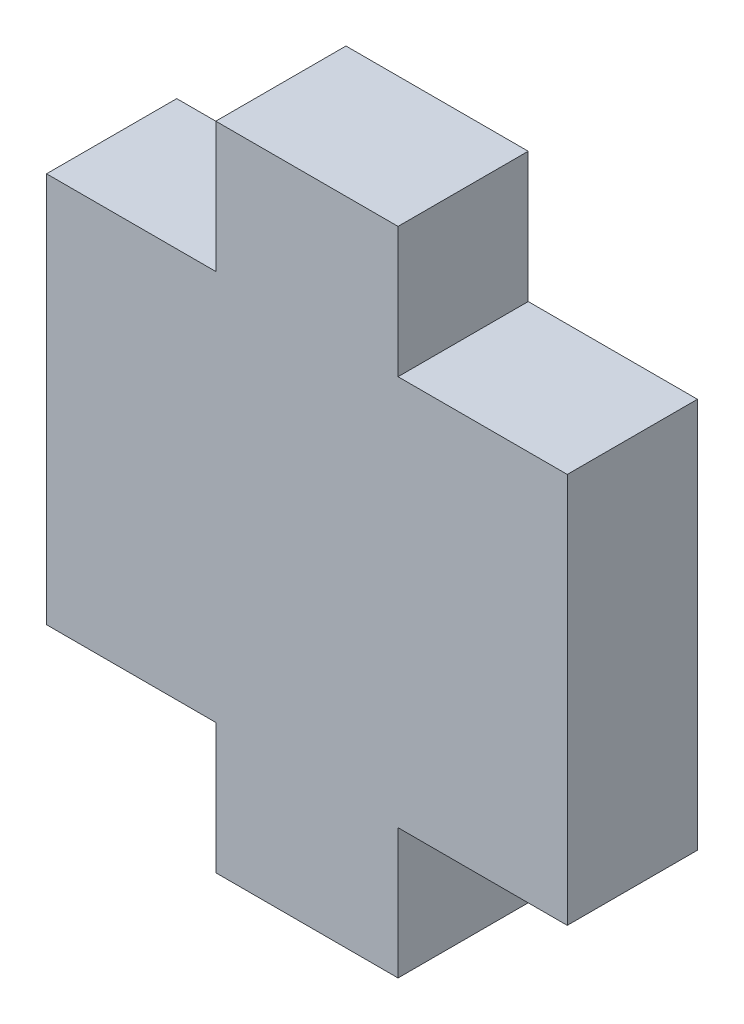
ISO-10303-21;
HEADER;
FILE_DESCRIPTION(('STEP AP214'),'2;1');
FILE_NAME('part.step','',(''),(''),'','','');
FILE_SCHEMA(('AUTOMOTIVE_DESIGN { 1 0 10303 214 1 1 1 1 }'));
ENDSEC;
DATA;
#1=APPLICATION_CONTEXT('core data for automotive mechanical design processes');
#2=APPLICATION_PROTOCOL_DEFINITION('international standard','automotive_design',2000,#1);
#3=PRODUCT_CONTEXT('',#1,'mechanical');
#4=PRODUCT('Part','Part','',(#3));
#5=PRODUCT_RELATED_PRODUCT_CATEGORY('part','',(#4));
#6=PRODUCT_DEFINITION_FORMATION('','',#4);
#7=PRODUCT_DEFINITION_CONTEXT('part definition',#1,'design');
#8=PRODUCT_DEFINITION('design','',#6,#7);
#9=PRODUCT_DEFINITION_SHAPE('','',#8);
#10=(LENGTH_UNIT() NAMED_UNIT(*) SI_UNIT(.MILLI.,.METRE.));
#11=(NAMED_UNIT(*) PLANE_ANGLE_UNIT() SI_UNIT($,.RADIAN.));
#12=(NAMED_UNIT(*) SI_UNIT($,.STERADIAN.) SOLID_ANGLE_UNIT());
#13=UNCERTAINTY_MEASURE_WITH_UNIT(LENGTH_MEASURE(1.E-05),#10,'distance_accuracy_value','');
#14=(GEOMETRIC_REPRESENTATION_CONTEXT(3) GLOBAL_UNCERTAINTY_ASSIGNED_CONTEXT((#13)) GLOBAL_UNIT_ASSIGNED_CONTEXT((#10,
#11,#12)) REPRESENTATION_CONTEXT('',''));
#15=CARTESIAN_POINT('',(0.,0.,0.));
#16=DIRECTION('',(0.,0.,1.));
#17=DIRECTION('',(1.,0.,0.));
#18=AXIS2_PLACEMENT_3D('',#15,#16,#17);
#19=CARTESIAN_POINT('',(-3.5,-7.5,5.));
#20=DIRECTION('',(0.,1.,0.));
#21=DIRECTION('',(-1.,0.,0.));
#22=AXIS2_PLACEMENT_3D('',#19,#20,#21);
#23=PLANE('',#22);
#24=DIRECTION('',(1.,0.,0.));
#25=VECTOR('',#24,1.);
#26=CARTESIAN_POINT('',(-3.5,-7.5,0.));
#27=LINE('',#26,#25);
#28=CARTESIAN_POINT('',(-10.,-7.5,0.));
#29=VERTEX_POINT('',#28);
#30=CARTESIAN_POINT('',(-3.5,-7.5,0.));
#31=VERTEX_POINT('',#30);
#32=EDGE_CURVE('E161',#29,#31,#27,.T.);
#33=ORIENTED_EDGE('',*,*,#32,.T.);
#34=DIRECTION('',(0.,0.,-1.));
#35=VECTOR('',#34,1.);
#36=CARTESIAN_POINT('',(-3.5,-7.5,5.));
#37=LINE('',#36,#35);
#38=CARTESIAN_POINT('',(-3.5,-7.5,5.));
#39=VERTEX_POINT('',#38);
#40=EDGE_CURVE('E11',#39,#31,#37,.T.);
#41=ORIENTED_EDGE('',*,*,#40,.F.);
#42=DIRECTION('',(1.,0.,0.));
#43=VECTOR('',#42,1.);
#44=CARTESIAN_POINT('',(-3.5,-7.5,5.));
#45=LINE('',#44,#43);
#46=CARTESIAN_POINT('',(-10.,-7.5,5.));
#47=VERTEX_POINT('',#46);
#48=EDGE_CURVE('E183',#47,#39,#45,.T.);
#49=ORIENTED_EDGE('',*,*,#48,.F.);
#50=DIRECTION('',(0.,0.,-1.));
#51=VECTOR('',#50,1.);
#52=CARTESIAN_POINT('',(-10.,-7.5,5.));
#53=LINE('',#52,#51);
#54=EDGE_CURVE('E157',#47,#29,#53,.T.);
#55=ORIENTED_EDGE('',*,*,#54,.T.);
#56=EDGE_LOOP('',(#33,#41,#49,#55));
#57=FACE_BOUND('',#56,.T.);
#58=ADVANCED_FACE('F41',(#57),#23,.F.);
#59=CARTESIAN_POINT('',(-3.5,-12.5,5.));
#60=DIRECTION('',(1.,0.,0.));
#61=DIRECTION('',(0.,0.,-1.));
#62=AXIS2_PLACEMENT_3D('',#59,#60,#61);
#63=PLANE('',#62);
#64=DIRECTION('',(0.,-1.,0.));
#65=VECTOR('',#64,1.);
#66=CARTESIAN_POINT('',(-3.5,-12.5,0.));
#67=LINE('',#66,#65);
#68=CARTESIAN_POINT('',(-3.5,-12.5,0.));
#69=VERTEX_POINT('',#68);
#70=EDGE_CURVE('E164',#31,#69,#67,.T.);
#71=ORIENTED_EDGE('',*,*,#70,.T.);
#72=DIRECTION('',(0.,0.,-1.));
#73=VECTOR('',#72,1.);
#74=CARTESIAN_POINT('',(-3.5,-12.5,5.));
#75=LINE('',#74,#73);
#76=CARTESIAN_POINT('',(-3.5,-12.5,5.));
#77=VERTEX_POINT('',#76);
#78=EDGE_CURVE('E49',#77,#69,#75,.T.);
#79=ORIENTED_EDGE('',*,*,#78,.F.);
#80=DIRECTION('',(0.,-1.,0.));
#81=VECTOR('',#80,1.);
#82=CARTESIAN_POINT('',(-3.5,-12.5,5.));
#83=LINE('',#82,#81);
#84=EDGE_CURVE('E112',#39,#77,#83,.T.);
#85=ORIENTED_EDGE('',*,*,#84,.F.);
#86=ORIENTED_EDGE('',*,*,#40,.T.);
#87=EDGE_LOOP('',(#71,#79,#85,#86));
#88=FACE_BOUND('',#87,.T.);
#89=ADVANCED_FACE('F261',(#88),#63,.F.);
#90=CARTESIAN_POINT('',(3.5,-12.5,5.));
#91=DIRECTION('',(0.,1.,0.));
#92=DIRECTION('',(0.,0.,1.));
#93=AXIS2_PLACEMENT_3D('',#90,#91,#92);
#94=PLANE('',#93);
#95=DIRECTION('',(1.,0.,0.));
#96=VECTOR('',#95,1.);
#97=CARTESIAN_POINT('',(3.5,-12.5,0.));
#98=LINE('',#97,#96);
#99=CARTESIAN_POINT('',(3.5,-12.5,0.));
#100=VERTEX_POINT('',#99);
#101=EDGE_CURVE('E166',#69,#100,#98,.T.);
#102=ORIENTED_EDGE('',*,*,#101,.T.);
#103=DIRECTION('',(0.,0.,-1.));
#104=VECTOR('',#103,1.);
#105=CARTESIAN_POINT('',(3.5,-12.5,5.));
#106=LINE('',#105,#104);
#107=CARTESIAN_POINT('',(3.5,-12.5,5.));
#108=VERTEX_POINT('',#107);
#109=EDGE_CURVE('E202',#108,#100,#106,.T.);
#110=ORIENTED_EDGE('',*,*,#109,.F.);
#111=DIRECTION('',(1.,0.,0.));
#112=VECTOR('',#111,1.);
#113=CARTESIAN_POINT('',(3.5,-12.5,5.));
#114=LINE('',#113,#112);
#115=EDGE_CURVE('E210',#77,#108,#114,.T.);
#116=ORIENTED_EDGE('',*,*,#115,.F.);
#117=ORIENTED_EDGE('',*,*,#78,.T.);
#118=EDGE_LOOP('',(#102,#110,#116,#117));
#119=FACE_BOUND('',#118,.T.);
#120=ADVANCED_FACE('F208',(#119),#94,.F.);
#121=CARTESIAN_POINT('',(3.5,-7.5,5.));
#122=DIRECTION('',(-1.,0.,0.));
#123=DIRECTION('',(0.,0.,1.));
#124=AXIS2_PLACEMENT_3D('',#121,#122,#123);
#125=PLANE('',#124);
#126=DIRECTION('',(0.,1.,0.));
#127=VECTOR('',#126,1.);
#128=CARTESIAN_POINT('',(3.5,-7.5,0.));
#129=LINE('',#128,#127);
#130=CARTESIAN_POINT('',(3.5,-7.5,0.));
#131=VERTEX_POINT('',#130);
#132=EDGE_CURVE('E168',#100,#131,#129,.T.);
#133=ORIENTED_EDGE('',*,*,#132,.T.);
#134=DIRECTION('',(0.,0.,-1.));
#135=VECTOR('',#134,1.);
#136=CARTESIAN_POINT('',(3.5,-7.5,5.));
#137=LINE('',#136,#135);
#138=CARTESIAN_POINT('',(3.5,-7.5,5.));
#139=VERTEX_POINT('',#138);
#140=EDGE_CURVE('E199',#139,#131,#137,.T.);
#141=ORIENTED_EDGE('',*,*,#140,.F.);
#142=DIRECTION('',(0.,1.,0.));
#143=VECTOR('',#142,1.);
#144=CARTESIAN_POINT('',(3.5,-7.5,5.));
#145=LINE('',#144,#143);
#146=EDGE_CURVE('E228',#108,#139,#145,.T.);
#147=ORIENTED_EDGE('',*,*,#146,.F.);
#148=ORIENTED_EDGE('',*,*,#109,.T.);
#149=EDGE_LOOP('',(#133,#141,#147,#148));
#150=FACE_BOUND('',#149,.T.);
#151=ADVANCED_FACE('F219',(#150),#125,.F.);
#152=CARTESIAN_POINT('',(10.,-7.5,5.));
#153=DIRECTION('',(0.,1.,0.));
#154=DIRECTION('',(-1.,0.,0.));
#155=AXIS2_PLACEMENT_3D('',#152,#153,#154);
#156=PLANE('',#155);
#157=DIRECTION('',(1.,0.,0.));
#158=VECTOR('',#157,1.);
#159=CARTESIAN_POINT('',(10.,-7.5,0.));
#160=LINE('',#159,#158);
#161=CARTESIAN_POINT('',(10.,-7.5,0.));
#162=VERTEX_POINT('',#161);
#163=EDGE_CURVE('E170',#131,#162,#160,.T.);
#164=ORIENTED_EDGE('',*,*,#163,.T.);
#165=DIRECTION('',(0.,0.,-1.));
#166=VECTOR('',#165,1.);
#167=CARTESIAN_POINT('',(10.,-7.5,5.));
#168=LINE('',#167,#166);
#169=CARTESIAN_POINT('',(10.,-7.5,5.));
#170=VERTEX_POINT('',#169);
#171=EDGE_CURVE('E196',#170,#162,#168,.T.);
#172=ORIENTED_EDGE('',*,*,#171,.F.);
#173=DIRECTION('',(1.,0.,0.));
#174=VECTOR('',#173,1.);
#175=CARTESIAN_POINT('',(10.,-7.5,5.));
#176=LINE('',#175,#174);
#177=EDGE_CURVE('E225',#139,#170,#176,.T.);
#178=ORIENTED_EDGE('',*,*,#177,.F.);
#179=ORIENTED_EDGE('',*,*,#140,.T.);
#180=EDGE_LOOP('',(#164,#172,#178,#179));
#181=FACE_BOUND('',#180,.T.);
#182=ADVANCED_FACE('F223',(#181),#156,.F.);
#183=CARTESIAN_POINT('',(10.,7.5,5.));
#184=DIRECTION('',(-1.,0.,0.));
#185=DIRECTION('',(0.,0.,1.));
#186=AXIS2_PLACEMENT_3D('',#183,#184,#185);
#187=PLANE('',#186);
#188=DIRECTION('',(0.,1.,0.));
#189=VECTOR('',#188,1.);
#190=CARTESIAN_POINT('',(10.,7.5,0.));
#191=LINE('',#190,#189);
#192=CARTESIAN_POINT('',(10.,7.5,0.));
#193=VERTEX_POINT('',#192);
#194=EDGE_CURVE('E172',#162,#193,#191,.T.);
#195=ORIENTED_EDGE('',*,*,#194,.T.);
#196=DIRECTION('',(0.,0.,-1.));
#197=VECTOR('',#196,1.);
#198=CARTESIAN_POINT('',(10.,7.5,5.));
#199=LINE('',#198,#197);
#200=CARTESIAN_POINT('',(10.,7.5,5.));
#201=VERTEX_POINT('',#200);
#202=EDGE_CURVE('E193',#201,#193,#199,.T.);
#203=ORIENTED_EDGE('',*,*,#202,.F.);
#204=DIRECTION('',(0.,1.,0.));
#205=VECTOR('',#204,1.);
#206=CARTESIAN_POINT('',(10.,7.5,5.));
#207=LINE('',#206,#205);
#208=EDGE_CURVE('E227',#170,#201,#207,.T.);
#209=ORIENTED_EDGE('',*,*,#208,.F.);
#210=ORIENTED_EDGE('',*,*,#171,.T.);
#211=EDGE_LOOP('',(#195,#203,#209,#210));
#212=FACE_BOUND('',#211,.T.);
#213=ADVANCED_FACE('F274',(#212),#187,.F.);
#214=CARTESIAN_POINT('',(3.5,7.5,5.));
#215=DIRECTION('',(0.,-1.,0.));
#216=DIRECTION('',(1.,0.,0.));
#217=AXIS2_PLACEMENT_3D('',#214,#215,#216);
#218=PLANE('',#217);
#219=DIRECTION('',(-1.,0.,0.));
#220=VECTOR('',#219,1.);
#221=CARTESIAN_POINT('',(3.5,7.5,0.));
#222=LINE('',#221,#220);
#223=CARTESIAN_POINT('',(3.5,7.5,0.));
#224=VERTEX_POINT('',#223);
#225=EDGE_CURVE('E174',#193,#224,#222,.T.);
#226=ORIENTED_EDGE('',*,*,#225,.T.);
#227=DIRECTION('',(0.,0.,-1.));
#228=VECTOR('',#227,1.);
#229=CARTESIAN_POINT('',(3.5,7.5,5.));
#230=LINE('',#229,#228);
#231=CARTESIAN_POINT('',(3.5,7.5,5.));
#232=VERTEX_POINT('',#231);
#233=EDGE_CURVE('E190',#232,#224,#230,.T.);
#234=ORIENTED_EDGE('',*,*,#233,.F.);
#235=DIRECTION('',(-1.,0.,0.));
#236=VECTOR('',#235,1.);
#237=CARTESIAN_POINT('',(3.5,7.5,5.));
#238=LINE('',#237,#236);
#239=EDGE_CURVE('E230',#201,#232,#238,.T.);
#240=ORIENTED_EDGE('',*,*,#239,.F.);
#241=ORIENTED_EDGE('',*,*,#202,.T.);
#242=EDGE_LOOP('',(#226,#234,#240,#241));
#243=FACE_BOUND('',#242,.T.);
#244=ADVANCED_FACE('F277',(#243),#218,.F.);
#245=CARTESIAN_POINT('',(3.5,12.5,5.));
#246=DIRECTION('',(-1.,0.,0.));
#247=DIRECTION('',(0.,0.,1.));
#248=AXIS2_PLACEMENT_3D('',#245,#246,#247);
#249=PLANE('',#248);
#250=DIRECTION('',(0.,1.,0.));
#251=VECTOR('',#250,1.);
#252=CARTESIAN_POINT('',(3.5,12.5,0.));
#253=LINE('',#252,#251);
#254=CARTESIAN_POINT('',(3.5,12.5,0.));
#255=VERTEX_POINT('',#254);
#256=EDGE_CURVE('E176',#224,#255,#253,.T.);
#257=ORIENTED_EDGE('',*,*,#256,.T.);
#258=DIRECTION('',(0.,0.,-1.));
#259=VECTOR('',#258,1.);
#260=CARTESIAN_POINT('',(3.5,12.5,5.));
#261=LINE('',#260,#259);
#262=CARTESIAN_POINT('',(3.5,12.5,5.));
#263=VERTEX_POINT('',#262);
#264=EDGE_CURVE('E187',#263,#255,#261,.T.);
#265=ORIENTED_EDGE('',*,*,#264,.F.);
#266=DIRECTION('',(0.,1.,0.));
#267=VECTOR('',#266,1.);
#268=CARTESIAN_POINT('',(3.5,12.5,5.));
#269=LINE('',#268,#267);
#270=EDGE_CURVE('E236',#232,#263,#269,.T.);
#271=ORIENTED_EDGE('',*,*,#270,.F.);
#272=ORIENTED_EDGE('',*,*,#233,.T.);
#273=EDGE_LOOP('',(#257,#265,#271,#272));
#274=FACE_BOUND('',#273,.T.);
#275=ADVANCED_FACE('F242',(#274),#249,.F.);
#276=CARTESIAN_POINT('',(-3.5,12.5,5.));
#277=DIRECTION('',(0.,-1.,0.));
#278=DIRECTION('',(0.,0.,-1.));
#279=AXIS2_PLACEMENT_3D('',#276,#277,#278);
#280=PLANE('',#279);
#281=DIRECTION('',(-1.,0.,0.));
#282=VECTOR('',#281,1.);
#283=CARTESIAN_POINT('',(-3.5,12.5,0.));
#284=LINE('',#283,#282);
#285=CARTESIAN_POINT('',(-3.5,12.5,0.));
#286=VERTEX_POINT('',#285);
#287=EDGE_CURVE('E178',#255,#286,#284,.T.);
#288=ORIENTED_EDGE('',*,*,#287,.T.);
#289=DIRECTION('',(0.,0.,-1.));
#290=VECTOR('',#289,1.);
#291=CARTESIAN_POINT('',(-3.5,12.5,5.));
#292=LINE('',#291,#290);
#293=CARTESIAN_POINT('',(-3.5,12.5,5.));
#294=VERTEX_POINT('',#293);
#295=EDGE_CURVE('E152',#294,#286,#292,.T.);
#296=ORIENTED_EDGE('',*,*,#295,.F.);
#297=DIRECTION('',(-1.,0.,0.));
#298=VECTOR('',#297,1.);
#299=CARTESIAN_POINT('',(-3.5,12.5,5.));
#300=LINE('',#299,#298);
#301=EDGE_CURVE('E143',#263,#294,#300,.T.);
#302=ORIENTED_EDGE('',*,*,#301,.F.);
#303=ORIENTED_EDGE('',*,*,#264,.T.);
#304=EDGE_LOOP('',(#288,#296,#302,#303));
#305=FACE_BOUND('',#304,.T.);
#306=ADVANCED_FACE('F246',(#305),#280,.F.);
#307=CARTESIAN_POINT('',(-3.5,7.5,5.));
#308=DIRECTION('',(1.,0.,0.));
#309=DIRECTION('',(0.,0.,-1.));
#310=AXIS2_PLACEMENT_3D('',#307,#308,#309);
#311=PLANE('',#310);
#312=DIRECTION('',(0.,-1.,0.));
#313=VECTOR('',#312,1.);
#314=CARTESIAN_POINT('',(-3.5,7.5,0.));
#315=LINE('',#314,#313);
#316=CARTESIAN_POINT('',(-3.5,7.5,0.));
#317=VERTEX_POINT('',#316);
#318=EDGE_CURVE('E151',#286,#317,#315,.T.);
#319=ORIENTED_EDGE('',*,*,#318,.T.);
#320=DIRECTION('',(0.,0.,-1.));
#321=VECTOR('',#320,1.);
#322=CARTESIAN_POINT('',(-3.5,7.5,5.));
#323=LINE('',#322,#321);
#324=CARTESIAN_POINT('',(-3.5,7.5,5.));
#325=VERTEX_POINT('',#324);
#326=EDGE_CURVE('E148',#325,#317,#323,.T.);
#327=ORIENTED_EDGE('',*,*,#326,.F.);
#328=DIRECTION('',(0.,-1.,0.));
#329=VECTOR('',#328,1.);
#330=CARTESIAN_POINT('',(-3.5,7.5,5.));
#331=LINE('',#330,#329);
#332=EDGE_CURVE('E137',#294,#325,#331,.T.);
#333=ORIENTED_EDGE('',*,*,#332,.F.);
#334=ORIENTED_EDGE('',*,*,#295,.T.);
#335=EDGE_LOOP('',(#319,#327,#333,#334));
#336=FACE_BOUND('',#335,.T.);
#337=ADVANCED_FACE('F149',(#336),#311,.F.);
#338=CARTESIAN_POINT('',(-10.,7.5,5.));
#339=DIRECTION('',(0.,-1.,0.));
#340=DIRECTION('',(1.,0.,0.));
#341=AXIS2_PLACEMENT_3D('',#338,#339,#340);
#342=PLANE('',#341);
#343=DIRECTION('',(-1.,0.,0.));
#344=VECTOR('',#343,1.);
#345=CARTESIAN_POINT('',(-10.,7.5,0.));
#346=LINE('',#345,#344);
#347=CARTESIAN_POINT('',(-10.,7.5,0.));
#348=VERTEX_POINT('',#347);
#349=EDGE_CURVE('E98',#317,#348,#346,.T.);
#350=ORIENTED_EDGE('',*,*,#349,.T.);
#351=DIRECTION('',(0.,0.,-1.));
#352=VECTOR('',#351,1.);
#353=CARTESIAN_POINT('',(-10.,7.5,5.));
#354=LINE('',#353,#352);
#355=CARTESIAN_POINT('',(-10.,7.5,5.));
#356=VERTEX_POINT('',#355);
#357=EDGE_CURVE('E153',#356,#348,#354,.T.);
#358=ORIENTED_EDGE('',*,*,#357,.F.);
#359=DIRECTION('',(-1.,0.,0.));
#360=VECTOR('',#359,1.);
#361=CARTESIAN_POINT('',(-10.,7.5,5.));
#362=LINE('',#361,#360);
#363=EDGE_CURVE('E141',#325,#356,#362,.T.);
#364=ORIENTED_EDGE('',*,*,#363,.F.);
#365=ORIENTED_EDGE('',*,*,#326,.T.);
#366=EDGE_LOOP('',(#350,#358,#364,#365));
#367=FACE_BOUND('',#366,.T.);
#368=ADVANCED_FACE('F155',(#367),#342,.F.);
#369=CARTESIAN_POINT('',(-10.,-7.5,5.));
#370=DIRECTION('',(1.,0.,0.));
#371=DIRECTION('',(0.,0.,-1.));
#372=AXIS2_PLACEMENT_3D('',#369,#370,#371);
#373=PLANE('',#372);
#374=DIRECTION('',(0.,-1.,0.));
#375=VECTOR('',#374,1.);
#376=CARTESIAN_POINT('',(-10.,-7.5,0.));
#377=LINE('',#376,#375);
#378=EDGE_CURVE('E104',#348,#29,#377,.T.);
#379=ORIENTED_EDGE('',*,*,#378,.T.);
#380=ORIENTED_EDGE('',*,*,#54,.F.);
#381=DIRECTION('',(0.,-1.,0.));
#382=VECTOR('',#381,1.);
#383=CARTESIAN_POINT('',(-10.,-7.5,5.));
#384=LINE('',#383,#382);
#385=EDGE_CURVE('E57',#356,#47,#384,.T.);
#386=ORIENTED_EDGE('',*,*,#385,.F.);
#387=ORIENTED_EDGE('',*,*,#357,.T.);
#388=EDGE_LOOP('',(#379,#380,#386,#387));
#389=FACE_BOUND('',#388,.T.);
#390=ADVANCED_FACE('F250',(#389),#373,.F.);
#391=CARTESIAN_POINT('',(0.,0.,5.));
#392=DIRECTION('',(0.,0.,-1.));
#393=DIRECTION('',(-1.,0.,0.));
#394=AXIS2_PLACEMENT_3D('',#391,#392,#393);
#395=PLANE('',#394);
#396=ORIENTED_EDGE('',*,*,#48,.T.);
#397=ORIENTED_EDGE('',*,*,#84,.T.);
#398=ORIENTED_EDGE('',*,*,#115,.T.);
#399=ORIENTED_EDGE('',*,*,#146,.T.);
#400=ORIENTED_EDGE('',*,*,#177,.T.);
#401=ORIENTED_EDGE('',*,*,#208,.T.);
#402=ORIENTED_EDGE('',*,*,#239,.T.);
#403=ORIENTED_EDGE('',*,*,#270,.T.);
#404=ORIENTED_EDGE('',*,*,#301,.T.);
#405=ORIENTED_EDGE('',*,*,#332,.T.);
#406=ORIENTED_EDGE('',*,*,#363,.T.);
#407=ORIENTED_EDGE('',*,*,#385,.T.);
#408=EDGE_LOOP('',(#396,#397,#398,#399,#400,#401,#402,#403,#404,#405,#406,#407));
#409=FACE_BOUND('',#408,.T.);
#410=ADVANCED_FACE('F139',(#409),#395,.F.);
#411=CARTESIAN_POINT('',(0.,0.,0.));
#412=DIRECTION('',(0.,0.,-1.));
#413=DIRECTION('',(-1.,0.,0.));
#414=AXIS2_PLACEMENT_3D('',#411,#412,#413);
#415=PLANE('',#414);
#416=ORIENTED_EDGE('',*,*,#32,.F.);
#417=ORIENTED_EDGE('',*,*,#378,.F.);
#418=ORIENTED_EDGE('',*,*,#349,.F.);
#419=ORIENTED_EDGE('',*,*,#318,.F.);
#420=ORIENTED_EDGE('',*,*,#287,.F.);
#421=ORIENTED_EDGE('',*,*,#256,.F.);
#422=ORIENTED_EDGE('',*,*,#225,.F.);
#423=ORIENTED_EDGE('',*,*,#194,.F.);
#424=ORIENTED_EDGE('',*,*,#163,.F.);
#425=ORIENTED_EDGE('',*,*,#132,.F.);
#426=ORIENTED_EDGE('',*,*,#101,.F.);
#427=ORIENTED_EDGE('',*,*,#70,.F.);
#428=EDGE_LOOP('',(#416,#417,#418,#419,#420,#421,#422,#423,#424,#425,#426,#427));
#429=FACE_BOUND('',#428,.T.);
#430=ADVANCED_FACE('F214',(#429),#415,.T.);
#431=CLOSED_SHELL('',(#58,#89,#120,#151,#182,#213,#244,#275,#306,#337,#368,#390,#410,#430));
#432=MANIFOLD_SOLID_BREP('B2',#431);
#433=ADVANCED_BREP_SHAPE_REPRESENTATION('',(#18,#432),#14);
#434=SHAPE_DEFINITION_REPRESENTATION(#9,#433);
ENDSEC;
END-ISO-10303-21;
